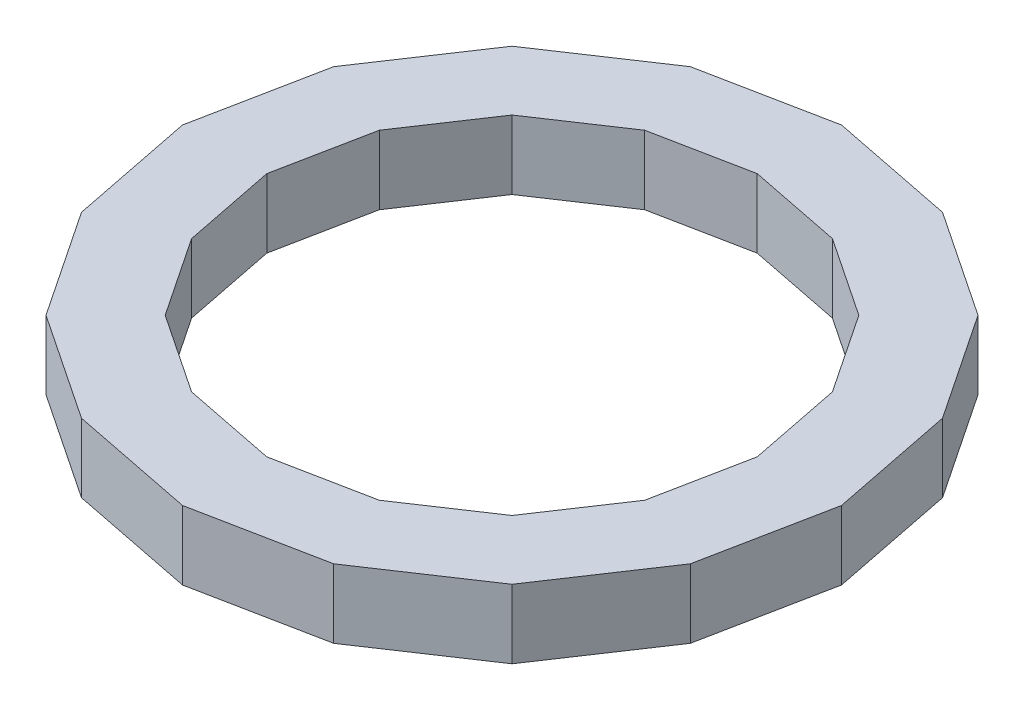
ISO-10303-21;
HEADER;
FILE_DESCRIPTION(('STEP AP214'),'2;1');
FILE_NAME('part.step','',(''),(''),'','','');
FILE_SCHEMA(('AUTOMOTIVE_DESIGN { 1 0 10303 214 1 1 1 1 }'));
ENDSEC;
DATA;
#1=APPLICATION_CONTEXT('core data for automotive mechanical design processes');
#2=APPLICATION_PROTOCOL_DEFINITION('international standard','automotive_design',2000,#1);
#3=PRODUCT_CONTEXT('',#1,'mechanical');
#4=PRODUCT('Part','Part','',(#3));
#5=PRODUCT_RELATED_PRODUCT_CATEGORY('part','',(#4));
#6=PRODUCT_DEFINITION_FORMATION('','',#4);
#7=PRODUCT_DEFINITION_CONTEXT('part definition',#1,'design');
#8=PRODUCT_DEFINITION('design','',#6,#7);
#9=PRODUCT_DEFINITION_SHAPE('','',#8);
#10=(LENGTH_UNIT() NAMED_UNIT(*) SI_UNIT(.MILLI.,.METRE.));
#11=(NAMED_UNIT(*) PLANE_ANGLE_UNIT() SI_UNIT($,.RADIAN.));
#12=(NAMED_UNIT(*) SI_UNIT($,.STERADIAN.) SOLID_ANGLE_UNIT());
#13=UNCERTAINTY_MEASURE_WITH_UNIT(LENGTH_MEASURE(1.E-05),#10,'distance_accuracy_value','');
#14=(GEOMETRIC_REPRESENTATION_CONTEXT(3) GLOBAL_UNCERTAINTY_ASSIGNED_CONTEXT((#13)) GLOBAL_UNIT_ASSIGNED_CONTEXT((#10,
#11,#12)) REPRESENTATION_CONTEXT('',''));
#15=CARTESIAN_POINT('',(0.,0.,0.));
#16=DIRECTION('',(0.,0.,1.));
#17=DIRECTION('',(1.,0.,0.));
#18=AXIS2_PLACEMENT_3D('',#15,#16,#17);
#19=CARTESIAN_POINT('',(0.,19.05,0.));
#20=DIRECTION('',(0.,1.,0.));
#21=DIRECTION('',(0.,0.,1.));
#22=AXIS2_PLACEMENT_3D('',#19,#20,#21);
#23=PLANE('',#22);
#24=DIRECTION('',(0.195090322016116,0.,-0.980785280403233));
#25=VECTOR('',#24,1.);
#26=CARTESIAN_POINT('',(84.1998614707948,19.05,34.8767245711379));
#27=LINE('',#26,#25);
#28=CARTESIAN_POINT('',(84.1998614707948,19.05,34.8767245711379));
#29=VERTEX_POINT('',#28);
#30=CARTESIAN_POINT('',(91.1372733216879,19.05,-1.08593207949279E-12));
#31=VERTEX_POINT('',#30);
#32=EDGE_CURVE('E373',#29,#31,#27,.T.);
#33=ORIENTED_EDGE('',*,*,#32,.T.);
#34=DIRECTION('',(-0.19509032201614,0.,-0.980785280403228));
#35=VECTOR('',#34,1.);
#36=CARTESIAN_POINT('',(91.1372733216879,19.05,-1.08593207949279E-12));
#37=LINE('',#36,#35);
#38=CARTESIAN_POINT('',(84.199861470794,19.05,-34.8767245711399));
#39=VERTEX_POINT('',#38);
#40=EDGE_CURVE('E376',#31,#39,#37,.T.);
#41=ORIENTED_EDGE('',*,*,#40,.T.);
#42=DIRECTION('',(-0.555570233019612,0.,-0.831469612302538));
#43=VECTOR('',#42,1.);
#44=CARTESIAN_POINT('',(84.199861470794,19.05,-34.8767245711399));
#45=LINE('',#44,#43);
#46=CARTESIAN_POINT('',(64.4437839846166,19.05,-64.4437839846181));
#47=VERTEX_POINT('',#46);
#48=EDGE_CURVE('E380',#39,#47,#45,.T.);
#49=ORIENTED_EDGE('',*,*,#48,.T.);
#50=DIRECTION('',(-0.831469612302552,0.,-0.555570233019592));
#51=VECTOR('',#50,1.);
#52=CARTESIAN_POINT('',(64.4437839846166,19.05,-64.4437839846181));
#53=LINE('',#52,#51);
#54=CARTESIAN_POINT('',(34.8767245711378,19.05,-84.1998614707949));
#55=VERTEX_POINT('',#54);
#56=EDGE_CURVE('E383',#47,#55,#53,.T.);
#57=ORIENTED_EDGE('',*,*,#56,.T.);
#58=DIRECTION('',(-0.980785280403233,0.,-0.195090322016116));
#59=VECTOR('',#58,1.);
#60=CARTESIAN_POINT('',(34.8767245711378,19.05,-84.1998614707949));
#61=LINE('',#60,#59);
#62=CARTESIAN_POINT('',(-1.07584243553213E-12,19.05,-91.137273321688));
#63=VERTEX_POINT('',#62);
#64=EDGE_CURVE('E385',#55,#63,#61,.T.);
#65=ORIENTED_EDGE('',*,*,#64,.T.);
#66=DIRECTION('',(-0.980785280403228,0.,0.19509032201614));
#67=VECTOR('',#66,1.);
#68=CARTESIAN_POINT('',(-1.07584243553213E-12,19.05,-91.137273321688));
#69=LINE('',#68,#67);
#70=CARTESIAN_POINT('',(-34.8767245711399,19.05,-84.199861470794));
#71=VERTEX_POINT('',#70);
#72=EDGE_CURVE('E387',#63,#71,#69,.T.);
#73=ORIENTED_EDGE('',*,*,#72,.T.);
#74=DIRECTION('',(-0.831469612302539,0.,0.555570233019612));
#75=VECTOR('',#74,1.);
#76=CARTESIAN_POINT('',(-34.8767245711399,19.05,-84.199861470794));
#77=LINE('',#76,#75);
#78=CARTESIAN_POINT('',(-64.4437839846182,19.05,-64.4437839846166));
#79=VERTEX_POINT('',#78);
#80=EDGE_CURVE('E389',#71,#79,#77,.T.);
#81=ORIENTED_EDGE('',*,*,#80,.T.);
#82=DIRECTION('',(-0.555570233019592,0.,0.831469612302552));
#83=VECTOR('',#82,1.);
#84=CARTESIAN_POINT('',(-64.4437839846182,19.05,-64.4437839846166));
#85=LINE('',#84,#83);
#86=CARTESIAN_POINT('',(-84.1998614707948,19.05,-34.8767245711379));
#87=VERTEX_POINT('',#86);
#88=EDGE_CURVE('E391',#79,#87,#85,.T.);
#89=ORIENTED_EDGE('',*,*,#88,.T.);
#90=DIRECTION('',(-0.195090322016116,0.,0.980785280403233));
#91=VECTOR('',#90,1.);
#92=CARTESIAN_POINT('',(-84.1998614707948,19.05,-34.8767245711379));
#93=LINE('',#92,#91);
#94=CARTESIAN_POINT('',(-91.1372733216879,19.05,1.10251581367233E-12));
#95=VERTEX_POINT('',#94);
#96=EDGE_CURVE('E393',#87,#95,#93,.T.);
#97=ORIENTED_EDGE('',*,*,#96,.T.);
#98=DIRECTION('',(0.19509032201614,0.,0.980785280403228));
#99=VECTOR('',#98,1.);
#100=CARTESIAN_POINT('',(-91.1372733216879,19.05,1.10251581367233E-12));
#101=LINE('',#100,#99);
#102=CARTESIAN_POINT('',(-84.199861470794,19.05,34.8767245711399));
#103=VERTEX_POINT('',#102);
#104=EDGE_CURVE('E395',#95,#103,#101,.T.);
#105=ORIENTED_EDGE('',*,*,#104,.T.);
#106=DIRECTION('',(0.555570233019612,0.,0.831469612302539));
#107=VECTOR('',#106,1.);
#108=CARTESIAN_POINT('',(-84.199861470794,19.05,34.8767245711399));
#109=LINE('',#108,#107);
#110=CARTESIAN_POINT('',(-64.4437839846166,19.05,64.4437839846182));
#111=VERTEX_POINT('',#110);
#112=EDGE_CURVE('E397',#103,#111,#109,.T.);
#113=ORIENTED_EDGE('',*,*,#112,.T.);
#114=DIRECTION('',(0.831469612302552,0.,0.555570233019592));
#115=VECTOR('',#114,1.);
#116=CARTESIAN_POINT('',(-64.4437839846166,19.05,64.4437839846182));
#117=LINE('',#116,#115);
#118=CARTESIAN_POINT('',(-34.8767245711378,19.05,84.1998614707949));
#119=VERTEX_POINT('',#118);
#120=EDGE_CURVE('E399',#111,#119,#117,.T.);
#121=ORIENTED_EDGE('',*,*,#120,.T.);
#122=DIRECTION('',(0.980785280403233,0.,0.195090322016116));
#123=VECTOR('',#122,1.);
#124=CARTESIAN_POINT('',(-34.8767245711378,19.05,84.1998614707949));
#125=LINE('',#124,#123);
#126=CARTESIAN_POINT('',(1.02228948115089E-12,19.05,91.1372733216879));
#127=VERTEX_POINT('',#126);
#128=EDGE_CURVE('E401',#119,#127,#125,.T.);
#129=ORIENTED_EDGE('',*,*,#128,.T.);
#130=DIRECTION('',(0.980785280403228,0.,-0.19509032201614));
#131=VECTOR('',#130,1.);
#132=CARTESIAN_POINT('',(1.02228948115089E-12,19.05,91.1372733216879));
#133=LINE('',#132,#131);
#134=CARTESIAN_POINT('',(34.8767245711399,19.05,84.199861470794));
#135=VERTEX_POINT('',#134);
#136=EDGE_CURVE('E403',#127,#135,#133,.T.);
#137=ORIENTED_EDGE('',*,*,#136,.T.);
#138=DIRECTION('',(0.831469612302539,0.,-0.555570233019612));
#139=VECTOR('',#138,1.);
#140=CARTESIAN_POINT('',(34.8767245711399,19.05,84.199861470794));
#141=LINE('',#140,#139);
#142=CARTESIAN_POINT('',(64.4437839846181,19.05,64.4437839846166));
#143=VERTEX_POINT('',#142);
#144=EDGE_CURVE('E405',#135,#143,#141,.T.);
#145=ORIENTED_EDGE('',*,*,#144,.T.);
#146=DIRECTION('',(0.555570233019592,0.,-0.831469612302552));
#147=VECTOR('',#146,1.);
#148=CARTESIAN_POINT('',(64.4437839846181,19.05,64.4437839846166));
#149=LINE('',#148,#147);
#150=EDGE_CURVE('E408',#143,#29,#149,.T.);
#151=ORIENTED_EDGE('',*,*,#150,.T.);
#152=EDGE_LOOP('',(#33,#41,#49,#57,#65,#73,#81,#89,#97,#105,#113,#121,#129,#137,#145,#151));
#153=FACE_BOUND('',#152,.T.);
#154=DIRECTION('',(-0.19509032201614,0.,-0.980785280403228));
#155=VECTOR('',#154,1.);
#156=CARTESIAN_POINT('',(67.8294194450458,19.05,-8.537545795901E-13));
#157=LINE('',#156,#155);
#158=CARTESIAN_POINT('',(67.8294194450458,19.05,-8.537545795901E-13));
#159=VERTEX_POINT('',#158);
#160=CARTESIAN_POINT('',(62.6662123274006,19.05,-25.9571950485622));
#161=VERTEX_POINT('',#160);
#162=EDGE_CURVE('E252',#159,#161,#157,.T.);
#163=ORIENTED_EDGE('',*,*,#162,.F.);
#164=DIRECTION('',(0.195090322016116,0.,-0.980785280403233));
#165=VECTOR('',#164,1.);
#166=CARTESIAN_POINT('',(62.6662123274012,19.05,25.9571950485607));
#167=LINE('',#166,#165);
#168=CARTESIAN_POINT('',(62.6662123274012,19.05,25.9571950485607));
#169=VERTEX_POINT('',#168);
#170=EDGE_CURVE('E244',#169,#159,#167,.T.);
#171=ORIENTED_EDGE('',*,*,#170,.F.);
#172=DIRECTION('',(0.555570233019592,0.,-0.831469612302552));
#173=VECTOR('',#172,1.);
#174=CARTESIAN_POINT('',(47.9626424535392,19.05,47.962642453538));
#175=LINE('',#174,#173);
#176=CARTESIAN_POINT('',(47.9626424535392,19.05,47.962642453538));
#177=VERTEX_POINT('',#176);
#178=EDGE_CURVE('E298',#177,#169,#175,.T.);
#179=ORIENTED_EDGE('',*,*,#178,.F.);
#180=DIRECTION('',(0.831469612302539,0.,-0.555570233019612));
#181=VECTOR('',#180,1.);
#182=CARTESIAN_POINT('',(25.9571950485622,19.05,62.6662123274006));
#183=LINE('',#182,#181);
#184=CARTESIAN_POINT('',(25.9571950485622,19.05,62.6662123274006));
#185=VERTEX_POINT('',#184);
#186=EDGE_CURVE('E295',#185,#177,#183,.T.);
#187=ORIENTED_EDGE('',*,*,#186,.F.);
#188=DIRECTION('',(0.980785280403228,0.,-0.19509032201614));
#189=VECTOR('',#188,1.);
#190=CARTESIAN_POINT('',(8.14446550787997E-13,19.05,67.8294194450458));
#191=LINE('',#190,#189);
#192=CARTESIAN_POINT('',(8.14446550787997E-13,19.05,67.8294194450458));
#193=VERTEX_POINT('',#192);
#194=EDGE_CURVE('E293',#193,#185,#191,.T.);
#195=ORIENTED_EDGE('',*,*,#194,.F.);
#196=DIRECTION('',(0.980785280403233,0.,0.195090322016116));
#197=VECTOR('',#196,1.);
#198=CARTESIAN_POINT('',(-25.9571950485607,19.05,62.6662123274012));
#199=LINE('',#198,#197);
#200=CARTESIAN_POINT('',(-25.9571950485607,19.05,62.6662123274012));
#201=VERTEX_POINT('',#200);
#202=EDGE_CURVE('E291',#201,#193,#199,.T.);
#203=ORIENTED_EDGE('',*,*,#202,.F.);
#204=DIRECTION('',(0.831469612302552,0.,0.555570233019592));
#205=VECTOR('',#204,1.);
#206=CARTESIAN_POINT('',(-47.962642453538,19.05,47.9626424535392));
#207=LINE('',#206,#205);
#208=CARTESIAN_POINT('',(-47.962642453538,19.05,47.9626424535392));
#209=VERTEX_POINT('',#208);
#210=EDGE_CURVE('E289',#209,#201,#207,.T.);
#211=ORIENTED_EDGE('',*,*,#210,.F.);
#212=DIRECTION('',(0.555570233019613,0.,0.831469612302538));
#213=VECTOR('',#212,1.);
#214=CARTESIAN_POINT('',(-62.6662123274006,19.05,25.9571950485622));
#215=LINE('',#214,#213);
#216=CARTESIAN_POINT('',(-62.6662123274006,19.05,25.9571950485622));
#217=VERTEX_POINT('',#216);
#218=EDGE_CURVE('E287',#217,#209,#215,.T.);
#219=ORIENTED_EDGE('',*,*,#218,.F.);
#220=DIRECTION('',(0.19509032201614,0.,0.980785280403228));
#221=VECTOR('',#220,1.);
#222=CARTESIAN_POINT('',(-67.8294194450458,19.05,8.67260643679946E-13));
#223=LINE('',#222,#221);
#224=CARTESIAN_POINT('',(-67.8294194450458,19.05,8.67260643679946E-13));
#225=VERTEX_POINT('',#224);
#226=EDGE_CURVE('E285',#225,#217,#223,.T.);
#227=ORIENTED_EDGE('',*,*,#226,.F.);
#228=DIRECTION('',(-0.195090322016115,0.,0.980785280403233));
#229=VECTOR('',#228,1.);
#230=CARTESIAN_POINT('',(-62.6662123274013,19.05,-25.9571950485607));
#231=LINE('',#230,#229);
#232=CARTESIAN_POINT('',(-62.6662123274013,19.05,-25.9571950485607));
#233=VERTEX_POINT('',#232);
#234=EDGE_CURVE('E283',#233,#225,#231,.T.);
#235=ORIENTED_EDGE('',*,*,#234,.F.);
#236=DIRECTION('',(-0.555570233019592,0.,0.831469612302552));
#237=VECTOR('',#236,1.);
#238=CARTESIAN_POINT('',(-47.9626424535392,19.05,-47.962642453538));
#239=LINE('',#238,#237);
#240=CARTESIAN_POINT('',(-47.9626424535392,19.05,-47.962642453538));
#241=VERTEX_POINT('',#240);
#242=EDGE_CURVE('E281',#241,#233,#239,.T.);
#243=ORIENTED_EDGE('',*,*,#242,.F.);
#244=DIRECTION('',(-0.831469612302538,0.,0.555570233019613));
#245=VECTOR('',#244,1.);
#246=CARTESIAN_POINT('',(-25.9571950485622,19.05,-62.6662123274006));
#247=LINE('',#246,#245);
#248=CARTESIAN_POINT('',(-25.9571950485622,19.05,-62.6662123274006));
#249=VERTEX_POINT('',#248);
#250=EDGE_CURVE('E279',#249,#241,#247,.T.);
#251=ORIENTED_EDGE('',*,*,#250,.F.);
#252=DIRECTION('',(-0.980785280403228,0.,0.19509032201614));
#253=VECTOR('',#252,1.);
#254=CARTESIAN_POINT('',(-8.46439854206043E-13,19.05,-67.8294194450458));
#255=LINE('',#254,#253);
#256=CARTESIAN_POINT('',(-8.46439854206043E-13,19.05,-67.8294194450458));
#257=VERTEX_POINT('',#256);
#258=EDGE_CURVE('E277',#257,#249,#255,.T.);
#259=ORIENTED_EDGE('',*,*,#258,.F.);
#260=DIRECTION('',(-0.980785280403233,0.,-0.195090322016116));
#261=VECTOR('',#260,1.);
#262=CARTESIAN_POINT('',(25.9571950485605,19.05,-62.6662123274013));
#263=LINE('',#262,#261);
#264=CARTESIAN_POINT('',(25.9571950485605,19.05,-62.6662123274013));
#265=VERTEX_POINT('',#264);
#266=EDGE_CURVE('E275',#265,#257,#263,.T.);
#267=ORIENTED_EDGE('',*,*,#266,.F.);
#268=DIRECTION('',(-0.831469612302552,0.,-0.555570233019592));
#269=VECTOR('',#268,1.);
#270=CARTESIAN_POINT('',(47.9626424535379,19.05,-47.9626424535391));
#271=LINE('',#270,#269);
#272=CARTESIAN_POINT('',(47.9626424535379,19.05,-47.9626424535391));
#273=VERTEX_POINT('',#272);
#274=EDGE_CURVE('E271',#273,#265,#271,.T.);
#275=ORIENTED_EDGE('',*,*,#274,.F.);
#276=DIRECTION('',(-0.555570233019613,0.,-0.831469612302538));
#277=VECTOR('',#276,1.);
#278=CARTESIAN_POINT('',(62.6662123274006,19.05,-25.9571950485622));
#279=LINE('',#278,#277);
#280=EDGE_CURVE('E265',#161,#273,#279,.T.);
#281=ORIENTED_EDGE('',*,*,#280,.F.);
#282=EDGE_LOOP('',(#163,#171,#179,#187,#195,#203,#211,#219,#227,#235,#243,#251,#259,#267,#275,#281));
#283=FACE_BOUND('',#282,.T.);
#284=ADVANCED_FACE('F35',(#153,#283),#23,.T.);
#285=CARTESIAN_POINT('',(0.,0.,0.));
#286=DIRECTION('',(0.,1.,0.));
#287=DIRECTION('',(0.,0.,1.));
#288=AXIS2_PLACEMENT_3D('',#285,#286,#287);
#289=PLANE('',#288);
#290=DIRECTION('',(0.195090322016116,0.,-0.980785280403233));
#291=VECTOR('',#290,1.);
#292=CARTESIAN_POINT('',(84.1998614707948,0.,34.8767245711379));
#293=LINE('',#292,#291);
#294=CARTESIAN_POINT('',(84.1998614707948,0.,34.8767245711379));
#295=VERTEX_POINT('',#294);
#296=CARTESIAN_POINT('',(91.1372733216879,0.,-1.08593207949279E-12));
#297=VERTEX_POINT('',#296);
#298=EDGE_CURVE('E260',#295,#297,#293,.T.);
#299=ORIENTED_EDGE('',*,*,#298,.F.);
#300=DIRECTION('',(0.555570233019592,0.,-0.831469612302552));
#301=VECTOR('',#300,1.);
#302=CARTESIAN_POINT('',(64.4437839846181,0.,64.4437839846166));
#303=LINE('',#302,#301);
#304=CARTESIAN_POINT('',(64.4437839846181,0.,64.4437839846166));
#305=VERTEX_POINT('',#304);
#306=EDGE_CURVE('E377',#305,#295,#303,.T.);
#307=ORIENTED_EDGE('',*,*,#306,.F.);
#308=DIRECTION('',(0.831469612302539,0.,-0.555570233019612));
#309=VECTOR('',#308,1.);
#310=CARTESIAN_POINT('',(34.8767245711399,0.,84.199861470794));
#311=LINE('',#310,#309);
#312=CARTESIAN_POINT('',(34.8767245711399,0.,84.199861470794));
#313=VERTEX_POINT('',#312);
#314=EDGE_CURVE('E442',#313,#305,#311,.T.);
#315=ORIENTED_EDGE('',*,*,#314,.F.);
#316=DIRECTION('',(0.980785280403228,0.,-0.19509032201614));
#317=VECTOR('',#316,1.);
#318=CARTESIAN_POINT('',(1.02228948115089E-12,0.,91.1372733216879));
#319=LINE('',#318,#317);
#320=CARTESIAN_POINT('',(1.02228948115089E-12,0.,91.1372733216879));
#321=VERTEX_POINT('',#320);
#322=EDGE_CURVE('E440',#321,#313,#319,.T.);
#323=ORIENTED_EDGE('',*,*,#322,.F.);
#324=DIRECTION('',(0.980785280403233,0.,0.195090322016116));
#325=VECTOR('',#324,1.);
#326=CARTESIAN_POINT('',(-34.8767245711378,0.,84.1998614707949));
#327=LINE('',#326,#325);
#328=CARTESIAN_POINT('',(-34.8767245711378,0.,84.1998614707949));
#329=VERTEX_POINT('',#328);
#330=EDGE_CURVE('E437',#329,#321,#327,.T.);
#331=ORIENTED_EDGE('',*,*,#330,.F.);
#332=DIRECTION('',(0.831469612302552,0.,0.555570233019592));
#333=VECTOR('',#332,1.);
#334=CARTESIAN_POINT('',(-64.4437839846166,0.,64.4437839846182));
#335=LINE('',#334,#333);
#336=CARTESIAN_POINT('',(-64.4437839846166,0.,64.4437839846182));
#337=VERTEX_POINT('',#336);
#338=EDGE_CURVE('E434',#337,#329,#335,.T.);
#339=ORIENTED_EDGE('',*,*,#338,.F.);
#340=DIRECTION('',(0.555570233019612,0.,0.831469612302539));
#341=VECTOR('',#340,1.);
#342=CARTESIAN_POINT('',(-84.199861470794,0.,34.8767245711399));
#343=LINE('',#342,#341);
#344=CARTESIAN_POINT('',(-84.199861470794,0.,34.8767245711399));
#345=VERTEX_POINT('',#344);
#346=EDGE_CURVE('E432',#345,#337,#343,.T.);
#347=ORIENTED_EDGE('',*,*,#346,.F.);
#348=DIRECTION('',(0.19509032201614,0.,0.980785280403228));
#349=VECTOR('',#348,1.);
#350=CARTESIAN_POINT('',(-91.1372733216879,0.,1.10251581367233E-12));
#351=LINE('',#350,#349);
#352=CARTESIAN_POINT('',(-91.1372733216879,0.,1.10251581367233E-12));
#353=VERTEX_POINT('',#352);
#354=EDGE_CURVE('E430',#353,#345,#351,.T.);
#355=ORIENTED_EDGE('',*,*,#354,.F.);
#356=DIRECTION('',(-0.195090322016116,0.,0.980785280403233));
#357=VECTOR('',#356,1.);
#358=CARTESIAN_POINT('',(-84.1998614707948,0.,-34.8767245711379));
#359=LINE('',#358,#357);
#360=CARTESIAN_POINT('',(-84.1998614707948,0.,-34.8767245711379));
#361=VERTEX_POINT('',#360);
#362=EDGE_CURVE('E428',#361,#353,#359,.T.);
#363=ORIENTED_EDGE('',*,*,#362,.F.);
#364=DIRECTION('',(-0.555570233019592,0.,0.831469612302552));
#365=VECTOR('',#364,1.);
#366=CARTESIAN_POINT('',(-64.4437839846182,0.,-64.4437839846166));
#367=LINE('',#366,#365);
#368=CARTESIAN_POINT('',(-64.4437839846182,0.,-64.4437839846166));
#369=VERTEX_POINT('',#368);
#370=EDGE_CURVE('E426',#369,#361,#367,.T.);
#371=ORIENTED_EDGE('',*,*,#370,.F.);
#372=DIRECTION('',(-0.831469612302539,0.,0.555570233019612));
#373=VECTOR('',#372,1.);
#374=CARTESIAN_POINT('',(-34.8767245711399,0.,-84.199861470794));
#375=LINE('',#374,#373);
#376=CARTESIAN_POINT('',(-34.8767245711399,0.,-84.199861470794));
#377=VERTEX_POINT('',#376);
#378=EDGE_CURVE('E424',#377,#369,#375,.T.);
#379=ORIENTED_EDGE('',*,*,#378,.F.);
#380=DIRECTION('',(-0.980785280403228,0.,0.19509032201614));
#381=VECTOR('',#380,1.);
#382=CARTESIAN_POINT('',(-1.07584243553213E-12,0.,-91.137273321688));
#383=LINE('',#382,#381);
#384=CARTESIAN_POINT('',(-1.07584243553213E-12,0.,-91.137273321688));
#385=VERTEX_POINT('',#384);
#386=EDGE_CURVE('E422',#385,#377,#383,.T.);
#387=ORIENTED_EDGE('',*,*,#386,.F.);
#388=DIRECTION('',(-0.980785280403233,0.,-0.195090322016116));
#389=VECTOR('',#388,1.);
#390=CARTESIAN_POINT('',(34.8767245711378,0.,-84.1998614707949));
#391=LINE('',#390,#389);
#392=CARTESIAN_POINT('',(34.8767245711378,0.,-84.1998614707949));
#393=VERTEX_POINT('',#392);
#394=EDGE_CURVE('E420',#393,#385,#391,.T.);
#395=ORIENTED_EDGE('',*,*,#394,.F.);
#396=DIRECTION('',(-0.831469612302552,0.,-0.555570233019592));
#397=VECTOR('',#396,1.);
#398=CARTESIAN_POINT('',(64.4437839846166,0.,-64.4437839846181));
#399=LINE('',#398,#397);
#400=CARTESIAN_POINT('',(64.4437839846166,0.,-64.4437839846181));
#401=VERTEX_POINT('',#400);
#402=EDGE_CURVE('E418',#401,#393,#399,.T.);
#403=ORIENTED_EDGE('',*,*,#402,.F.);
#404=DIRECTION('',(-0.555570233019612,0.,-0.831469612302538));
#405=VECTOR('',#404,1.);
#406=CARTESIAN_POINT('',(84.199861470794,0.,-34.8767245711399));
#407=LINE('',#406,#405);
#408=CARTESIAN_POINT('',(84.199861470794,0.,-34.8767245711399));
#409=VERTEX_POINT('',#408);
#410=EDGE_CURVE('E415',#409,#401,#407,.T.);
#411=ORIENTED_EDGE('',*,*,#410,.F.);
#412=DIRECTION('',(-0.19509032201614,0.,-0.980785280403228));
#413=VECTOR('',#412,1.);
#414=CARTESIAN_POINT('',(91.1372733216879,0.,-1.08593207949279E-12));
#415=LINE('',#414,#413);
#416=EDGE_CURVE('E413',#297,#409,#415,.T.);
#417=ORIENTED_EDGE('',*,*,#416,.F.);
#418=EDGE_LOOP('',(#299,#307,#315,#323,#331,#339,#347,#355,#363,#371,#379,#387,#395,#403,#411,#417));
#419=FACE_BOUND('',#418,.T.);
#420=DIRECTION('',(0.195090322016116,0.,-0.980785280403233));
#421=VECTOR('',#420,1.);
#422=CARTESIAN_POINT('',(62.6662123274012,0.,25.9571950485607));
#423=LINE('',#422,#421);
#424=CARTESIAN_POINT('',(62.6662123274012,0.,25.9571950485607));
#425=VERTEX_POINT('',#424);
#426=CARTESIAN_POINT('',(67.8294194450458,0.,-8.537545795901E-13));
#427=VERTEX_POINT('',#426);
#428=EDGE_CURVE('E58',#425,#427,#423,.T.);
#429=ORIENTED_EDGE('',*,*,#428,.T.);
#430=DIRECTION('',(-0.19509032201614,0.,-0.980785280403228));
#431=VECTOR('',#430,1.);
#432=CARTESIAN_POINT('',(67.8294194450458,0.,-8.537545795901E-13));
#433=LINE('',#432,#431);
#434=CARTESIAN_POINT('',(62.6662123274006,0.,-25.9571950485622));
#435=VERTEX_POINT('',#434);
#436=EDGE_CURVE('E259',#427,#435,#433,.T.);
#437=ORIENTED_EDGE('',*,*,#436,.T.);
#438=DIRECTION('',(-0.555570233019613,0.,-0.831469612302538));
#439=VECTOR('',#438,1.);
#440=CARTESIAN_POINT('',(62.6662123274006,0.,-25.9571950485622));
#441=LINE('',#440,#439);
#442=CARTESIAN_POINT('',(47.9626424535379,0.,-47.9626424535391));
#443=VERTEX_POINT('',#442);
#444=EDGE_CURVE('E302',#435,#443,#441,.T.);
#445=ORIENTED_EDGE('',*,*,#444,.T.);
#446=DIRECTION('',(-0.831469612302552,0.,-0.555570233019592));
#447=VECTOR('',#446,1.);
#448=CARTESIAN_POINT('',(47.9626424535379,0.,-47.9626424535391));
#449=LINE('',#448,#447);
#450=CARTESIAN_POINT('',(25.9571950485605,0.,-62.6662123274013));
#451=VERTEX_POINT('',#450);
#452=EDGE_CURVE('E305',#443,#451,#449,.T.);
#453=ORIENTED_EDGE('',*,*,#452,.T.);
#454=DIRECTION('',(-0.980785280403233,0.,-0.195090322016116));
#455=VECTOR('',#454,1.);
#456=CARTESIAN_POINT('',(25.9571950485605,0.,-62.6662123274013));
#457=LINE('',#456,#455);
#458=CARTESIAN_POINT('',(-8.46439854206043E-13,0.,-67.8294194450458));
#459=VERTEX_POINT('',#458);
#460=EDGE_CURVE('E308',#451,#459,#457,.T.);
#461=ORIENTED_EDGE('',*,*,#460,.T.);
#462=DIRECTION('',(-0.980785280403228,0.,0.19509032201614));
#463=VECTOR('',#462,1.);
#464=CARTESIAN_POINT('',(-8.46439854206043E-13,0.,-67.8294194450458));
#465=LINE('',#464,#463);
#466=CARTESIAN_POINT('',(-25.9571950485622,0.,-62.6662123274006));
#467=VERTEX_POINT('',#466);
#468=EDGE_CURVE('E311',#459,#467,#465,.T.);
#469=ORIENTED_EDGE('',*,*,#468,.T.);
#470=DIRECTION('',(-0.831469612302538,0.,0.555570233019613));
#471=VECTOR('',#470,1.);
#472=CARTESIAN_POINT('',(-25.9571950485622,0.,-62.6662123274006));
#473=LINE('',#472,#471);
#474=CARTESIAN_POINT('',(-47.9626424535392,0.,-47.962642453538));
#475=VERTEX_POINT('',#474);
#476=EDGE_CURVE('E314',#467,#475,#473,.T.);
#477=ORIENTED_EDGE('',*,*,#476,.T.);
#478=DIRECTION('',(-0.555570233019592,0.,0.831469612302552));
#479=VECTOR('',#478,1.);
#480=CARTESIAN_POINT('',(-47.9626424535392,0.,-47.962642453538));
#481=LINE('',#480,#479);
#482=CARTESIAN_POINT('',(-62.6662123274013,0.,-25.9571950485607));
#483=VERTEX_POINT('',#482);
#484=EDGE_CURVE('E317',#475,#483,#481,.T.);
#485=ORIENTED_EDGE('',*,*,#484,.T.);
#486=DIRECTION('',(-0.195090322016115,0.,0.980785280403233));
#487=VECTOR('',#486,1.);
#488=CARTESIAN_POINT('',(-62.6662123274013,0.,-25.9571950485607));
#489=LINE('',#488,#487);
#490=CARTESIAN_POINT('',(-67.8294194450458,0.,8.67260643679946E-13));
#491=VERTEX_POINT('',#490);
#492=EDGE_CURVE('E320',#483,#491,#489,.T.);
#493=ORIENTED_EDGE('',*,*,#492,.T.);
#494=DIRECTION('',(0.19509032201614,0.,0.980785280403228));
#495=VECTOR('',#494,1.);
#496=CARTESIAN_POINT('',(-67.8294194450458,0.,8.67260643679946E-13));
#497=LINE('',#496,#495);
#498=CARTESIAN_POINT('',(-62.6662123274006,0.,25.9571950485622));
#499=VERTEX_POINT('',#498);
#500=EDGE_CURVE('E323',#491,#499,#497,.T.);
#501=ORIENTED_EDGE('',*,*,#500,.T.);
#502=DIRECTION('',(0.555570233019613,0.,0.831469612302538));
#503=VECTOR('',#502,1.);
#504=CARTESIAN_POINT('',(-62.6662123274006,0.,25.9571950485622));
#505=LINE('',#504,#503);
#506=CARTESIAN_POINT('',(-47.962642453538,0.,47.9626424535392));
#507=VERTEX_POINT('',#506);
#508=EDGE_CURVE('E326',#499,#507,#505,.T.);
#509=ORIENTED_EDGE('',*,*,#508,.T.);
#510=DIRECTION('',(0.831469612302552,0.,0.555570233019592));
#511=VECTOR('',#510,1.);
#512=CARTESIAN_POINT('',(-47.962642453538,0.,47.9626424535392));
#513=LINE('',#512,#511);
#514=CARTESIAN_POINT('',(-25.9571950485607,0.,62.6662123274012));
#515=VERTEX_POINT('',#514);
#516=EDGE_CURVE('E330',#507,#515,#513,.T.);
#517=ORIENTED_EDGE('',*,*,#516,.T.);
#518=DIRECTION('',(0.980785280403233,0.,0.195090322016116));
#519=VECTOR('',#518,1.);
#520=CARTESIAN_POINT('',(-25.9571950485607,0.,62.6662123274012));
#521=LINE('',#520,#519);
#522=CARTESIAN_POINT('',(8.14446550787997E-13,0.,67.8294194450458));
#523=VERTEX_POINT('',#522);
#524=EDGE_CURVE('E333',#515,#523,#521,.T.);
#525=ORIENTED_EDGE('',*,*,#524,.T.);
#526=DIRECTION('',(0.980785280403228,0.,-0.19509032201614));
#527=VECTOR('',#526,1.);
#528=CARTESIAN_POINT('',(8.14446550787997E-13,0.,67.8294194450458));
#529=LINE('',#528,#527);
#530=CARTESIAN_POINT('',(25.9571950485622,0.,62.6662123274006));
#531=VERTEX_POINT('',#530);
#532=EDGE_CURVE('E336',#523,#531,#529,.T.);
#533=ORIENTED_EDGE('',*,*,#532,.T.);
#534=DIRECTION('',(0.831469612302539,0.,-0.555570233019612));
#535=VECTOR('',#534,1.);
#536=CARTESIAN_POINT('',(25.9571950485622,0.,62.6662123274006));
#537=LINE('',#536,#535);
#538=CARTESIAN_POINT('',(47.9626424535392,0.,47.962642453538));
#539=VERTEX_POINT('',#538);
#540=EDGE_CURVE('E339',#531,#539,#537,.T.);
#541=ORIENTED_EDGE('',*,*,#540,.T.);
#542=DIRECTION('',(0.555570233019592,0.,-0.831469612302552));
#543=VECTOR('',#542,1.);
#544=CARTESIAN_POINT('',(47.9626424535392,0.,47.962642453538));
#545=LINE('',#544,#543);
#546=EDGE_CURVE('E253',#539,#425,#545,.T.);
#547=ORIENTED_EDGE('',*,*,#546,.T.);
#548=EDGE_LOOP('',(#429,#437,#445,#453,#461,#469,#477,#485,#493,#501,#509,#517,#525,#533,#541,#547));
#549=FACE_BOUND('',#548,.T.);
#550=ADVANCED_FACE('F501',(#419,#549),#289,.F.);
#551=CARTESIAN_POINT('',(84.1998614707948,19.05,34.8767245711379));
#552=DIRECTION('',(-0.980785280403233,0.,-0.195090322016116));
#553=DIRECTION('',(-0.195090322016116,0.,0.980785280403233));
#554=AXIS2_PLACEMENT_3D('',#551,#552,#553);
#555=PLANE('',#554);
#556=ORIENTED_EDGE('',*,*,#298,.T.);
#557=DIRECTION('',(0.,-1.,0.));
#558=VECTOR('',#557,1.);
#559=CARTESIAN_POINT('',(91.1372733216879,19.05,-1.08593207949279E-12));
#560=LINE('',#559,#558);
#561=EDGE_CURVE('E11',#31,#297,#560,.T.);
#562=ORIENTED_EDGE('',*,*,#561,.F.);
#563=ORIENTED_EDGE('',*,*,#32,.F.);
#564=DIRECTION('',(0.,-1.,0.));
#565=VECTOR('',#564,1.);
#566=CARTESIAN_POINT('',(84.1998614707948,19.05,34.8767245711379));
#567=LINE('',#566,#565);
#568=EDGE_CURVE('E410',#29,#295,#567,.T.);
#569=ORIENTED_EDGE('',*,*,#568,.T.);
#570=EDGE_LOOP('',(#556,#562,#563,#569));
#571=FACE_BOUND('',#570,.T.);
#572=ADVANCED_FACE('F37',(#571),#555,.F.);
#573=CARTESIAN_POINT('',(91.1372733216879,19.05,-1.08593207949279E-12));
#574=DIRECTION('',(-0.980785280403228,0.,0.19509032201614));
#575=DIRECTION('',(0.19509032201614,0.,0.980785280403228));
#576=AXIS2_PLACEMENT_3D('',#573,#574,#575);
#577=PLANE('',#576);
#578=ORIENTED_EDGE('',*,*,#416,.T.);
#579=DIRECTION('',(0.,-1.,0.));
#580=VECTOR('',#579,1.);
#581=CARTESIAN_POINT('',(84.199861470794,19.05,-34.8767245711399));
#582=LINE('',#581,#580);
#583=EDGE_CURVE('E43',#39,#409,#582,.T.);
#584=ORIENTED_EDGE('',*,*,#583,.F.);
#585=ORIENTED_EDGE('',*,*,#40,.F.);
#586=ORIENTED_EDGE('',*,*,#561,.T.);
#587=EDGE_LOOP('',(#578,#584,#585,#586));
#588=FACE_BOUND('',#587,.T.);
#589=ADVANCED_FACE('F518',(#588),#577,.F.);
#590=CARTESIAN_POINT('',(84.199861470794,19.05,-34.8767245711399));
#591=DIRECTION('',(-0.831469612302539,0.,0.555570233019612));
#592=DIRECTION('',(0.555570233019612,0.,0.831469612302539));
#593=AXIS2_PLACEMENT_3D('',#590,#591,#592);
#594=PLANE('',#593);
#595=ORIENTED_EDGE('',*,*,#410,.T.);
#596=DIRECTION('',(0.,-1.,0.));
#597=VECTOR('',#596,1.);
#598=CARTESIAN_POINT('',(64.4437839846166,19.05,-64.4437839846181));
#599=LINE('',#598,#597);
#600=EDGE_CURVE('E486',#47,#401,#599,.T.);
#601=ORIENTED_EDGE('',*,*,#600,.F.);
#602=ORIENTED_EDGE('',*,*,#48,.F.);
#603=ORIENTED_EDGE('',*,*,#583,.T.);
#604=EDGE_LOOP('',(#595,#601,#602,#603));
#605=FACE_BOUND('',#604,.T.);
#606=ADVANCED_FACE('F495',(#605),#594,.F.);
#607=CARTESIAN_POINT('',(64.4437839846166,19.05,-64.4437839846181));
#608=DIRECTION('',(-0.555570233019592,0.,0.831469612302552));
#609=DIRECTION('',(0.831469612302552,0.,0.555570233019592));
#610=AXIS2_PLACEMENT_3D('',#607,#608,#609);
#611=PLANE('',#610);
#612=ORIENTED_EDGE('',*,*,#402,.T.);
#613=DIRECTION('',(0.,-1.,0.));
#614=VECTOR('',#613,1.);
#615=CARTESIAN_POINT('',(34.8767245711378,19.05,-84.1998614707949));
#616=LINE('',#615,#614);
#617=EDGE_CURVE('E483',#55,#393,#616,.T.);
#618=ORIENTED_EDGE('',*,*,#617,.F.);
#619=ORIENTED_EDGE('',*,*,#56,.F.);
#620=ORIENTED_EDGE('',*,*,#600,.T.);
#621=EDGE_LOOP('',(#612,#618,#619,#620));
#622=FACE_BOUND('',#621,.T.);
#623=ADVANCED_FACE('F507',(#622),#611,.F.);
#624=CARTESIAN_POINT('',(34.8767245711378,19.05,-84.1998614707949));
#625=DIRECTION('',(-0.195090322016116,0.,0.980785280403233));
#626=DIRECTION('',(0.980785280403233,0.,0.195090322016116));
#627=AXIS2_PLACEMENT_3D('',#624,#625,#626);
#628=PLANE('',#627);
#629=ORIENTED_EDGE('',*,*,#394,.T.);
#630=DIRECTION('',(0.,-1.,0.));
#631=VECTOR('',#630,1.);
#632=CARTESIAN_POINT('',(-1.07584243553213E-12,19.05,-91.137273321688));
#633=LINE('',#632,#631);
#634=EDGE_CURVE('E480',#63,#385,#633,.T.);
#635=ORIENTED_EDGE('',*,*,#634,.F.);
#636=ORIENTED_EDGE('',*,*,#64,.F.);
#637=ORIENTED_EDGE('',*,*,#617,.T.);
#638=EDGE_LOOP('',(#629,#635,#636,#637));
#639=FACE_BOUND('',#638,.T.);
#640=ADVANCED_FACE('F511',(#639),#628,.F.);
#641=CARTESIAN_POINT('',(-1.07584243553213E-12,19.05,-91.137273321688));
#642=DIRECTION('',(0.19509032201614,0.,0.980785280403228));
#643=DIRECTION('',(0.980785280403228,0.,-0.19509032201614));
#644=AXIS2_PLACEMENT_3D('',#641,#642,#643);
#645=PLANE('',#644);
#646=ORIENTED_EDGE('',*,*,#386,.T.);
#647=DIRECTION('',(0.,-1.,0.));
#648=VECTOR('',#647,1.);
#649=CARTESIAN_POINT('',(-34.8767245711399,19.05,-84.199861470794));
#650=LINE('',#649,#648);
#651=EDGE_CURVE('E476',#71,#377,#650,.T.);
#652=ORIENTED_EDGE('',*,*,#651,.F.);
#653=ORIENTED_EDGE('',*,*,#72,.F.);
#654=ORIENTED_EDGE('',*,*,#634,.T.);
#655=EDGE_LOOP('',(#646,#652,#653,#654));
#656=FACE_BOUND('',#655,.T.);
#657=ADVANCED_FACE('F571',(#656),#645,.F.);
#658=CARTESIAN_POINT('',(-34.8767245711399,19.05,-84.199861470794));
#659=DIRECTION('',(0.555570233019612,0.,0.831469612302538));
#660=DIRECTION('',(0.831469612302539,0.,-0.555570233019612));
#661=AXIS2_PLACEMENT_3D('',#658,#659,#660);
#662=PLANE('',#661);
#663=ORIENTED_EDGE('',*,*,#378,.T.);
#664=DIRECTION('',(0.,-1.,0.));
#665=VECTOR('',#664,1.);
#666=CARTESIAN_POINT('',(-64.4437839846182,19.05,-64.4437839846166));
#667=LINE('',#666,#665);
#668=EDGE_CURVE('E473',#79,#369,#667,.T.);
#669=ORIENTED_EDGE('',*,*,#668,.F.);
#670=ORIENTED_EDGE('',*,*,#80,.F.);
#671=ORIENTED_EDGE('',*,*,#651,.T.);
#672=EDGE_LOOP('',(#663,#669,#670,#671));
#673=FACE_BOUND('',#672,.T.);
#674=ADVANCED_FACE('F568',(#673),#662,.F.);
#675=CARTESIAN_POINT('',(-64.4437839846182,19.05,-64.4437839846166));
#676=DIRECTION('',(0.831469612302552,0.,0.555570233019592));
#677=DIRECTION('',(0.555570233019592,0.,-0.831469612302552));
#678=AXIS2_PLACEMENT_3D('',#675,#676,#677);
#679=PLANE('',#678);
#680=ORIENTED_EDGE('',*,*,#370,.T.);
#681=DIRECTION('',(0.,-1.,0.));
#682=VECTOR('',#681,1.);
#683=CARTESIAN_POINT('',(-84.1998614707948,19.05,-34.8767245711379));
#684=LINE('',#683,#682);
#685=EDGE_CURVE('E470',#87,#361,#684,.T.);
#686=ORIENTED_EDGE('',*,*,#685,.F.);
#687=ORIENTED_EDGE('',*,*,#88,.F.);
#688=ORIENTED_EDGE('',*,*,#668,.T.);
#689=EDGE_LOOP('',(#680,#686,#687,#688));
#690=FACE_BOUND('',#689,.T.);
#691=ADVANCED_FACE('F564',(#690),#679,.F.);
#692=CARTESIAN_POINT('',(-84.1998614707948,19.05,-34.8767245711379));
#693=DIRECTION('',(0.980785280403233,0.,0.195090322016116));
#694=DIRECTION('',(0.195090322016116,0.,-0.980785280403233));
#695=AXIS2_PLACEMENT_3D('',#692,#693,#694);
#696=PLANE('',#695);
#697=ORIENTED_EDGE('',*,*,#362,.T.);
#698=DIRECTION('',(0.,-1.,0.));
#699=VECTOR('',#698,1.);
#700=CARTESIAN_POINT('',(-91.1372733216879,19.05,1.10251581367233E-12));
#701=LINE('',#700,#699);
#702=EDGE_CURVE('E467',#95,#353,#701,.T.);
#703=ORIENTED_EDGE('',*,*,#702,.F.);
#704=ORIENTED_EDGE('',*,*,#96,.F.);
#705=ORIENTED_EDGE('',*,*,#685,.T.);
#706=EDGE_LOOP('',(#697,#703,#704,#705));
#707=FACE_BOUND('',#706,.T.);
#708=ADVANCED_FACE('F560',(#707),#696,.F.);
#709=CARTESIAN_POINT('',(-91.1372733216879,19.05,1.10251581367233E-12));
#710=DIRECTION('',(0.980785280403228,0.,-0.19509032201614));
#711=DIRECTION('',(-0.19509032201614,0.,-0.980785280403228));
#712=AXIS2_PLACEMENT_3D('',#709,#710,#711);
#713=PLANE('',#712);
#714=ORIENTED_EDGE('',*,*,#354,.T.);
#715=DIRECTION('',(0.,-1.,0.));
#716=VECTOR('',#715,1.);
#717=CARTESIAN_POINT('',(-84.199861470794,19.05,34.8767245711399));
#718=LINE('',#717,#716);
#719=EDGE_CURVE('E464',#103,#345,#718,.T.);
#720=ORIENTED_EDGE('',*,*,#719,.F.);
#721=ORIENTED_EDGE('',*,*,#104,.F.);
#722=ORIENTED_EDGE('',*,*,#702,.T.);
#723=EDGE_LOOP('',(#714,#720,#721,#722));
#724=FACE_BOUND('',#723,.T.);
#725=ADVANCED_FACE('F555',(#724),#713,.F.);
#726=CARTESIAN_POINT('',(-84.199861470794,19.05,34.8767245711399));
#727=DIRECTION('',(0.831469612302539,0.,-0.555570233019612));
#728=DIRECTION('',(-0.555570233019612,0.,-0.831469612302539));
#729=AXIS2_PLACEMENT_3D('',#726,#727,#728);
#730=PLANE('',#729);
#731=ORIENTED_EDGE('',*,*,#346,.T.);
#732=DIRECTION('',(0.,-1.,0.));
#733=VECTOR('',#732,1.);
#734=CARTESIAN_POINT('',(-64.4437839846166,19.05,64.4437839846182));
#735=LINE('',#734,#733);
#736=EDGE_CURVE('E461',#111,#337,#735,.T.);
#737=ORIENTED_EDGE('',*,*,#736,.F.);
#738=ORIENTED_EDGE('',*,*,#112,.F.);
#739=ORIENTED_EDGE('',*,*,#719,.T.);
#740=EDGE_LOOP('',(#731,#737,#738,#739));
#741=FACE_BOUND('',#740,.T.);
#742=ADVANCED_FACE('F549',(#741),#730,.F.);
#743=CARTESIAN_POINT('',(-64.4437839846166,19.05,64.4437839846182));
#744=DIRECTION('',(0.555570233019592,0.,-0.831469612302552));
#745=DIRECTION('',(-0.831469612302552,0.,-0.555570233019592));
#746=AXIS2_PLACEMENT_3D('',#743,#744,#745);
#747=PLANE('',#746);
#748=ORIENTED_EDGE('',*,*,#338,.T.);
#749=DIRECTION('',(0.,-1.,0.));
#750=VECTOR('',#749,1.);
#751=CARTESIAN_POINT('',(-34.8767245711378,19.05,84.1998614707949));
#752=LINE('',#751,#750);
#753=EDGE_CURVE('E458',#119,#329,#752,.T.);
#754=ORIENTED_EDGE('',*,*,#753,.F.);
#755=ORIENTED_EDGE('',*,*,#120,.F.);
#756=ORIENTED_EDGE('',*,*,#736,.T.);
#757=EDGE_LOOP('',(#748,#754,#755,#756));
#758=FACE_BOUND('',#757,.T.);
#759=ADVANCED_FACE('F545',(#758),#747,.F.);
#760=CARTESIAN_POINT('',(-34.8767245711378,19.05,84.1998614707949));
#761=DIRECTION('',(0.195090322016116,0.,-0.980785280403233));
#762=DIRECTION('',(-0.980785280403233,0.,-0.195090322016117));
#763=AXIS2_PLACEMENT_3D('',#760,#761,#762);
#764=PLANE('',#763);
#765=ORIENTED_EDGE('',*,*,#330,.T.);
#766=DIRECTION('',(0.,-1.,0.));
#767=VECTOR('',#766,1.);
#768=CARTESIAN_POINT('',(1.02228948115089E-12,19.05,91.1372733216879));
#769=LINE('',#768,#767);
#770=EDGE_CURVE('E455',#127,#321,#769,.T.);
#771=ORIENTED_EDGE('',*,*,#770,.F.);
#772=ORIENTED_EDGE('',*,*,#128,.F.);
#773=ORIENTED_EDGE('',*,*,#753,.T.);
#774=EDGE_LOOP('',(#765,#771,#772,#773));
#775=FACE_BOUND('',#774,.T.);
#776=ADVANCED_FACE('F540',(#775),#764,.F.);
#777=CARTESIAN_POINT('',(1.02228948115089E-12,19.05,91.1372733216879));
#778=DIRECTION('',(-0.19509032201614,0.,-0.980785280403228));
#779=DIRECTION('',(-0.980785280403228,0.,0.19509032201614));
#780=AXIS2_PLACEMENT_3D('',#777,#778,#779);
#781=PLANE('',#780);
#782=ORIENTED_EDGE('',*,*,#322,.T.);
#783=DIRECTION('',(0.,-1.,0.));
#784=VECTOR('',#783,1.);
#785=CARTESIAN_POINT('',(34.8767245711399,19.05,84.199861470794));
#786=LINE('',#785,#784);
#787=EDGE_CURVE('E452',#135,#313,#786,.T.);
#788=ORIENTED_EDGE('',*,*,#787,.F.);
#789=ORIENTED_EDGE('',*,*,#136,.F.);
#790=ORIENTED_EDGE('',*,*,#770,.T.);
#791=EDGE_LOOP('',(#782,#788,#789,#790));
#792=FACE_BOUND('',#791,.T.);
#793=ADVANCED_FACE('F534',(#792),#781,.F.);
#794=CARTESIAN_POINT('',(34.8767245711399,19.05,84.199861470794));
#795=DIRECTION('',(-0.555570233019612,0.,-0.831469612302539));
#796=DIRECTION('',(-0.831469612302539,0.,0.555570233019612));
#797=AXIS2_PLACEMENT_3D('',#794,#795,#796);
#798=PLANE('',#797);
#799=ORIENTED_EDGE('',*,*,#314,.T.);
#800=DIRECTION('',(0.,-1.,0.));
#801=VECTOR('',#800,1.);
#802=CARTESIAN_POINT('',(64.4437839846181,19.05,64.4437839846166));
#803=LINE('',#802,#801);
#804=EDGE_CURVE('E449',#143,#305,#803,.T.);
#805=ORIENTED_EDGE('',*,*,#804,.F.);
#806=ORIENTED_EDGE('',*,*,#144,.F.);
#807=ORIENTED_EDGE('',*,*,#787,.T.);
#808=EDGE_LOOP('',(#799,#805,#806,#807));
#809=FACE_BOUND('',#808,.T.);
#810=ADVANCED_FACE('F530',(#809),#798,.F.);
#811=CARTESIAN_POINT('',(64.4437839846181,19.05,64.4437839846166));
#812=DIRECTION('',(-0.831469612302552,0.,-0.555570233019592));
#813=DIRECTION('',(-0.555570233019592,0.,0.831469612302552));
#814=AXIS2_PLACEMENT_3D('',#811,#812,#813);
#815=PLANE('',#814);
#816=ORIENTED_EDGE('',*,*,#306,.T.);
#817=ORIENTED_EDGE('',*,*,#568,.F.);
#818=ORIENTED_EDGE('',*,*,#150,.F.);
#819=ORIENTED_EDGE('',*,*,#804,.T.);
#820=EDGE_LOOP('',(#816,#817,#818,#819));
#821=FACE_BOUND('',#820,.T.);
#822=ADVANCED_FACE('F525',(#821),#815,.F.);
#823=CARTESIAN_POINT('',(62.6662123274012,19.05,25.9571950485607));
#824=DIRECTION('',(-0.980785280403233,0.,-0.195090322016116));
#825=DIRECTION('',(-0.195090322016116,0.,0.980785280403233));
#826=AXIS2_PLACEMENT_3D('',#823,#824,#825);
#827=PLANE('',#826);
#828=ORIENTED_EDGE('',*,*,#428,.F.);
#829=DIRECTION('',(0.,-1.,0.));
#830=VECTOR('',#829,1.);
#831=CARTESIAN_POINT('',(62.6662123274012,19.05,25.9571950485607));
#832=LINE('',#831,#830);
#833=EDGE_CURVE('E248',#169,#425,#832,.T.);
#834=ORIENTED_EDGE('',*,*,#833,.F.);
#835=ORIENTED_EDGE('',*,*,#170,.T.);
#836=DIRECTION('',(0.,-1.,0.));
#837=VECTOR('',#836,1.);
#838=CARTESIAN_POINT('',(67.8294194450458,19.05,-8.537545795901E-13));
#839=LINE('',#838,#837);
#840=EDGE_CURVE('E247',#159,#427,#839,.T.);
#841=ORIENTED_EDGE('',*,*,#840,.T.);
#842=EDGE_LOOP('',(#828,#834,#835,#841));
#843=FACE_BOUND('',#842,.T.);
#844=ADVANCED_FACE('F246',(#843),#827,.T.);
#845=CARTESIAN_POINT('',(67.8294194450458,19.05,-8.537545795901E-13));
#846=DIRECTION('',(-0.980785280403228,0.,0.19509032201614));
#847=DIRECTION('',(0.19509032201614,0.,0.980785280403228));
#848=AXIS2_PLACEMENT_3D('',#845,#846,#847);
#849=PLANE('',#848);
#850=ORIENTED_EDGE('',*,*,#436,.F.);
#851=ORIENTED_EDGE('',*,*,#840,.F.);
#852=ORIENTED_EDGE('',*,*,#162,.T.);
#853=DIRECTION('',(0.,-1.,0.));
#854=VECTOR('',#853,1.);
#855=CARTESIAN_POINT('',(62.6662123274006,19.05,-25.9571950485622));
#856=LINE('',#855,#854);
#857=EDGE_CURVE('E261',#161,#435,#856,.T.);
#858=ORIENTED_EDGE('',*,*,#857,.T.);
#859=EDGE_LOOP('',(#850,#851,#852,#858));
#860=FACE_BOUND('',#859,.T.);
#861=ADVANCED_FACE('F256',(#860),#849,.T.);
#862=CARTESIAN_POINT('',(62.6662123274006,19.05,-25.9571950485622));
#863=DIRECTION('',(-0.831469612302538,0.,0.555570233019613));
#864=DIRECTION('',(0.555570233019613,0.,0.831469612302538));
#865=AXIS2_PLACEMENT_3D('',#862,#863,#864);
#866=PLANE('',#865);
#867=ORIENTED_EDGE('',*,*,#444,.F.);
#868=ORIENTED_EDGE('',*,*,#857,.F.);
#869=ORIENTED_EDGE('',*,*,#280,.T.);
#870=DIRECTION('',(0.,-1.,0.));
#871=VECTOR('',#870,1.);
#872=CARTESIAN_POINT('',(47.9626424535379,19.05,-47.9626424535391));
#873=LINE('',#872,#871);
#874=EDGE_CURVE('E369',#273,#443,#873,.T.);
#875=ORIENTED_EDGE('',*,*,#874,.T.);
#876=EDGE_LOOP('',(#867,#868,#869,#875));
#877=FACE_BOUND('',#876,.T.);
#878=ADVANCED_FACE('F653',(#877),#866,.T.);
#879=CARTESIAN_POINT('',(47.9626424535379,19.05,-47.9626424535391));
#880=DIRECTION('',(-0.555570233019592,0.,0.831469612302552));
#881=DIRECTION('',(0.831469612302552,0.,0.555570233019592));
#882=AXIS2_PLACEMENT_3D('',#879,#880,#881);
#883=PLANE('',#882);
#884=ORIENTED_EDGE('',*,*,#452,.F.);
#885=ORIENTED_EDGE('',*,*,#874,.F.);
#886=ORIENTED_EDGE('',*,*,#274,.T.);
#887=DIRECTION('',(0.,-1.,0.));
#888=VECTOR('',#887,1.);
#889=CARTESIAN_POINT('',(25.9571950485605,19.05,-62.6662123274013));
#890=LINE('',#889,#888);
#891=EDGE_CURVE('E367',#265,#451,#890,.T.);
#892=ORIENTED_EDGE('',*,*,#891,.T.);
#893=EDGE_LOOP('',(#884,#885,#886,#892));
#894=FACE_BOUND('',#893,.T.);
#895=ADVANCED_FACE('F659',(#894),#883,.T.);
#896=CARTESIAN_POINT('',(25.9571950485605,19.05,-62.6662123274013));
#897=DIRECTION('',(-0.195090322016116,0.,0.980785280403233));
#898=DIRECTION('',(0.980785280403233,0.,0.195090322016116));
#899=AXIS2_PLACEMENT_3D('',#896,#897,#898);
#900=PLANE('',#899);
#901=ORIENTED_EDGE('',*,*,#460,.F.);
#902=ORIENTED_EDGE('',*,*,#891,.F.);
#903=ORIENTED_EDGE('',*,*,#266,.T.);
#904=DIRECTION('',(0.,-1.,0.));
#905=VECTOR('',#904,1.);
#906=CARTESIAN_POINT('',(-8.46439854206043E-13,19.05,-67.8294194450458));
#907=LINE('',#906,#905);
#908=EDGE_CURVE('E365',#257,#459,#907,.T.);
#909=ORIENTED_EDGE('',*,*,#908,.T.);
#910=EDGE_LOOP('',(#901,#902,#903,#909));
#911=FACE_BOUND('',#910,.T.);
#912=ADVANCED_FACE('F667',(#911),#900,.T.);
#913=CARTESIAN_POINT('',(-8.46439854206043E-13,19.05,-67.8294194450458));
#914=DIRECTION('',(0.19509032201614,0.,0.980785280403228));
#915=DIRECTION('',(0.980785280403228,0.,-0.19509032201614));
#916=AXIS2_PLACEMENT_3D('',#913,#914,#915);
#917=PLANE('',#916);
#918=ORIENTED_EDGE('',*,*,#468,.F.);
#919=ORIENTED_EDGE('',*,*,#908,.F.);
#920=ORIENTED_EDGE('',*,*,#258,.T.);
#921=DIRECTION('',(0.,-1.,0.));
#922=VECTOR('',#921,1.);
#923=CARTESIAN_POINT('',(-25.9571950485622,19.05,-62.6662123274006));
#924=LINE('',#923,#922);
#925=EDGE_CURVE('E363',#249,#467,#924,.T.);
#926=ORIENTED_EDGE('',*,*,#925,.T.);
#927=EDGE_LOOP('',(#918,#919,#920,#926));
#928=FACE_BOUND('',#927,.T.);
#929=ADVANCED_FACE('F675',(#928),#917,.T.);
#930=CARTESIAN_POINT('',(-25.9571950485622,19.05,-62.6662123274006));
#931=DIRECTION('',(0.555570233019613,0.,0.831469612302538));
#932=DIRECTION('',(0.831469612302538,0.,-0.555570233019613));
#933=AXIS2_PLACEMENT_3D('',#930,#931,#932);
#934=PLANE('',#933);
#935=ORIENTED_EDGE('',*,*,#476,.F.);
#936=ORIENTED_EDGE('',*,*,#925,.F.);
#937=ORIENTED_EDGE('',*,*,#250,.T.);
#938=DIRECTION('',(0.,-1.,0.));
#939=VECTOR('',#938,1.);
#940=CARTESIAN_POINT('',(-47.9626424535392,19.05,-47.962642453538));
#941=LINE('',#940,#939);
#942=EDGE_CURVE('E361',#241,#475,#941,.T.);
#943=ORIENTED_EDGE('',*,*,#942,.T.);
#944=EDGE_LOOP('',(#935,#936,#937,#943));
#945=FACE_BOUND('',#944,.T.);
#946=ADVANCED_FACE('F683',(#945),#934,.T.);
#947=CARTESIAN_POINT('',(-47.9626424535392,19.05,-47.962642453538));
#948=DIRECTION('',(0.831469612302552,0.,0.555570233019592));
#949=DIRECTION('',(0.555570233019592,0.,-0.831469612302552));
#950=AXIS2_PLACEMENT_3D('',#947,#948,#949);
#951=PLANE('',#950);
#952=ORIENTED_EDGE('',*,*,#484,.F.);
#953=ORIENTED_EDGE('',*,*,#942,.F.);
#954=ORIENTED_EDGE('',*,*,#242,.T.);
#955=DIRECTION('',(0.,-1.,0.));
#956=VECTOR('',#955,1.);
#957=CARTESIAN_POINT('',(-62.6662123274013,19.05,-25.9571950485607));
#958=LINE('',#957,#956);
#959=EDGE_CURVE('E359',#233,#483,#958,.T.);
#960=ORIENTED_EDGE('',*,*,#959,.T.);
#961=EDGE_LOOP('',(#952,#953,#954,#960));
#962=FACE_BOUND('',#961,.T.);
#963=ADVANCED_FACE('F691',(#962),#951,.T.);
#964=CARTESIAN_POINT('',(-62.6662123274013,19.05,-25.9571950485607));
#965=DIRECTION('',(0.980785280403233,0.,0.195090322016115));
#966=DIRECTION('',(0.195090322016115,0.,-0.980785280403233));
#967=AXIS2_PLACEMENT_3D('',#964,#965,#966);
#968=PLANE('',#967);
#969=ORIENTED_EDGE('',*,*,#492,.F.);
#970=ORIENTED_EDGE('',*,*,#959,.F.);
#971=ORIENTED_EDGE('',*,*,#234,.T.);
#972=DIRECTION('',(0.,-1.,0.));
#973=VECTOR('',#972,1.);
#974=CARTESIAN_POINT('',(-67.8294194450458,19.05,8.67260643679946E-13));
#975=LINE('',#974,#973);
#976=EDGE_CURVE('E357',#225,#491,#975,.T.);
#977=ORIENTED_EDGE('',*,*,#976,.T.);
#978=EDGE_LOOP('',(#969,#970,#971,#977));
#979=FACE_BOUND('',#978,.T.);
#980=ADVANCED_FACE('F699',(#979),#968,.T.);
#981=CARTESIAN_POINT('',(-67.8294194450458,19.05,8.67260643679946E-13));
#982=DIRECTION('',(0.980785280403228,0.,-0.19509032201614));
#983=DIRECTION('',(-0.19509032201614,0.,-0.980785280403228));
#984=AXIS2_PLACEMENT_3D('',#981,#982,#983);
#985=PLANE('',#984);
#986=ORIENTED_EDGE('',*,*,#500,.F.);
#987=ORIENTED_EDGE('',*,*,#976,.F.);
#988=ORIENTED_EDGE('',*,*,#226,.T.);
#989=DIRECTION('',(0.,-1.,0.));
#990=VECTOR('',#989,1.);
#991=CARTESIAN_POINT('',(-62.6662123274006,19.05,25.9571950485622));
#992=LINE('',#991,#990);
#993=EDGE_CURVE('E355',#217,#499,#992,.T.);
#994=ORIENTED_EDGE('',*,*,#993,.T.);
#995=EDGE_LOOP('',(#986,#987,#988,#994));
#996=FACE_BOUND('',#995,.T.);
#997=ADVANCED_FACE('F707',(#996),#985,.T.);
#998=CARTESIAN_POINT('',(-62.6662123274006,19.05,25.9571950485622));
#999=DIRECTION('',(0.831469612302538,0.,-0.555570233019613));
#1000=DIRECTION('',(-0.555570233019613,0.,-0.831469612302538));
#1001=AXIS2_PLACEMENT_3D('',#998,#999,#1000);
#1002=PLANE('',#1001);
#1003=ORIENTED_EDGE('',*,*,#508,.F.);
#1004=ORIENTED_EDGE('',*,*,#993,.F.);
#1005=ORIENTED_EDGE('',*,*,#218,.T.);
#1006=DIRECTION('',(0.,-1.,0.));
#1007=VECTOR('',#1006,1.);
#1008=CARTESIAN_POINT('',(-47.962642453538,19.05,47.9626424535392));
#1009=LINE('',#1008,#1007);
#1010=EDGE_CURVE('E353',#209,#507,#1009,.T.);
#1011=ORIENTED_EDGE('',*,*,#1010,.T.);
#1012=EDGE_LOOP('',(#1003,#1004,#1005,#1011));
#1013=FACE_BOUND('',#1012,.T.);
#1014=ADVANCED_FACE('F715',(#1013),#1002,.T.);
#1015=CARTESIAN_POINT('',(-47.962642453538,19.05,47.9626424535392));
#1016=DIRECTION('',(0.555570233019592,0.,-0.831469612302552));
#1017=DIRECTION('',(-0.831469612302552,0.,-0.555570233019592));
#1018=AXIS2_PLACEMENT_3D('',#1015,#1016,#1017);
#1019=PLANE('',#1018);
#1020=ORIENTED_EDGE('',*,*,#516,.F.);
#1021=ORIENTED_EDGE('',*,*,#1010,.F.);
#1022=ORIENTED_EDGE('',*,*,#210,.T.);
#1023=DIRECTION('',(0.,-1.,0.));
#1024=VECTOR('',#1023,1.);
#1025=CARTESIAN_POINT('',(-25.9571950485607,19.05,62.6662123274012));
#1026=LINE('',#1025,#1024);
#1027=EDGE_CURVE('E351',#201,#515,#1026,.T.);
#1028=ORIENTED_EDGE('',*,*,#1027,.T.);
#1029=EDGE_LOOP('',(#1020,#1021,#1022,#1028));
#1030=FACE_BOUND('',#1029,.T.);
#1031=ADVANCED_FACE('F723',(#1030),#1019,.T.);
#1032=CARTESIAN_POINT('',(-25.9571950485607,19.05,62.6662123274012));
#1033=DIRECTION('',(0.195090322016116,0.,-0.980785280403233));
#1034=DIRECTION('',(-0.980785280403233,0.,-0.195090322016116));
#1035=AXIS2_PLACEMENT_3D('',#1032,#1033,#1034);
#1036=PLANE('',#1035);
#1037=ORIENTED_EDGE('',*,*,#524,.F.);
#1038=ORIENTED_EDGE('',*,*,#1027,.F.);
#1039=ORIENTED_EDGE('',*,*,#202,.T.);
#1040=DIRECTION('',(0.,-1.,0.));
#1041=VECTOR('',#1040,1.);
#1042=CARTESIAN_POINT('',(8.14446550787997E-13,19.05,67.8294194450458));
#1043=LINE('',#1042,#1041);
#1044=EDGE_CURVE('E349',#193,#523,#1043,.T.);
#1045=ORIENTED_EDGE('',*,*,#1044,.T.);
#1046=EDGE_LOOP('',(#1037,#1038,#1039,#1045));
#1047=FACE_BOUND('',#1046,.T.);
#1048=ADVANCED_FACE('F731',(#1047),#1036,.T.);
#1049=CARTESIAN_POINT('',(8.14446550787997E-13,19.05,67.8294194450458));
#1050=DIRECTION('',(-0.19509032201614,0.,-0.980785280403228));
#1051=DIRECTION('',(-0.980785280403228,0.,0.19509032201614));
#1052=AXIS2_PLACEMENT_3D('',#1049,#1050,#1051);
#1053=PLANE('',#1052);
#1054=ORIENTED_EDGE('',*,*,#532,.F.);
#1055=ORIENTED_EDGE('',*,*,#1044,.F.);
#1056=ORIENTED_EDGE('',*,*,#194,.T.);
#1057=DIRECTION('',(0.,-1.,0.));
#1058=VECTOR('',#1057,1.);
#1059=CARTESIAN_POINT('',(25.9571950485622,19.05,62.6662123274006));
#1060=LINE('',#1059,#1058);
#1061=EDGE_CURVE('E347',#185,#531,#1060,.T.);
#1062=ORIENTED_EDGE('',*,*,#1061,.T.);
#1063=EDGE_LOOP('',(#1054,#1055,#1056,#1062));
#1064=FACE_BOUND('',#1063,.T.);
#1065=ADVANCED_FACE('F739',(#1064),#1053,.T.);
#1066=CARTESIAN_POINT('',(25.9571950485622,19.05,62.6662123274006));
#1067=DIRECTION('',(-0.555570233019612,0.,-0.831469612302538));
#1068=DIRECTION('',(-0.831469612302539,0.,0.555570233019612));
#1069=AXIS2_PLACEMENT_3D('',#1066,#1067,#1068);
#1070=PLANE('',#1069);
#1071=ORIENTED_EDGE('',*,*,#540,.F.);
#1072=ORIENTED_EDGE('',*,*,#1061,.F.);
#1073=ORIENTED_EDGE('',*,*,#186,.T.);
#1074=DIRECTION('',(0.,-1.,0.));
#1075=VECTOR('',#1074,1.);
#1076=CARTESIAN_POINT('',(47.9626424535392,19.05,47.962642453538));
#1077=LINE('',#1076,#1075);
#1078=EDGE_CURVE('E50',#177,#539,#1077,.T.);
#1079=ORIENTED_EDGE('',*,*,#1078,.T.);
#1080=EDGE_LOOP('',(#1071,#1072,#1073,#1079));
#1081=FACE_BOUND('',#1080,.T.);
#1082=ADVANCED_FACE('F747',(#1081),#1070,.T.);
#1083=CARTESIAN_POINT('',(47.9626424535392,19.05,47.962642453538));
#1084=DIRECTION('',(-0.831469612302552,0.,-0.555570233019592));
#1085=DIRECTION('',(-0.555570233019592,0.,0.831469612302552));
#1086=AXIS2_PLACEMENT_3D('',#1083,#1084,#1085);
#1087=PLANE('',#1086);
#1088=ORIENTED_EDGE('',*,*,#546,.F.);
#1089=ORIENTED_EDGE('',*,*,#1078,.F.);
#1090=ORIENTED_EDGE('',*,*,#178,.T.);
#1091=ORIENTED_EDGE('',*,*,#833,.T.);
#1092=EDGE_LOOP('',(#1088,#1089,#1090,#1091));
#1093=FACE_BOUND('',#1092,.T.);
#1094=ADVANCED_FACE('F755',(#1093),#1087,.T.);
#1095=CLOSED_SHELL('',(#284,#550,#572,#589,#606,#623,#640,#657,#674,#691,#708,#725,#742,#759,
#776,#793,#810,#822,#844,#861,#878,#895,#912,#929,#946,#963,#980,#997,#1014,#1031,#1048,#1065,
#1082,#1094));
#1096=MANIFOLD_SOLID_BREP('B2',#1095);
#1097=ADVANCED_BREP_SHAPE_REPRESENTATION('',(#18,#1096),#14);
#1098=SHAPE_DEFINITION_REPRESENTATION(#9,#1097);
ENDSEC;
END-ISO-10303-21;
